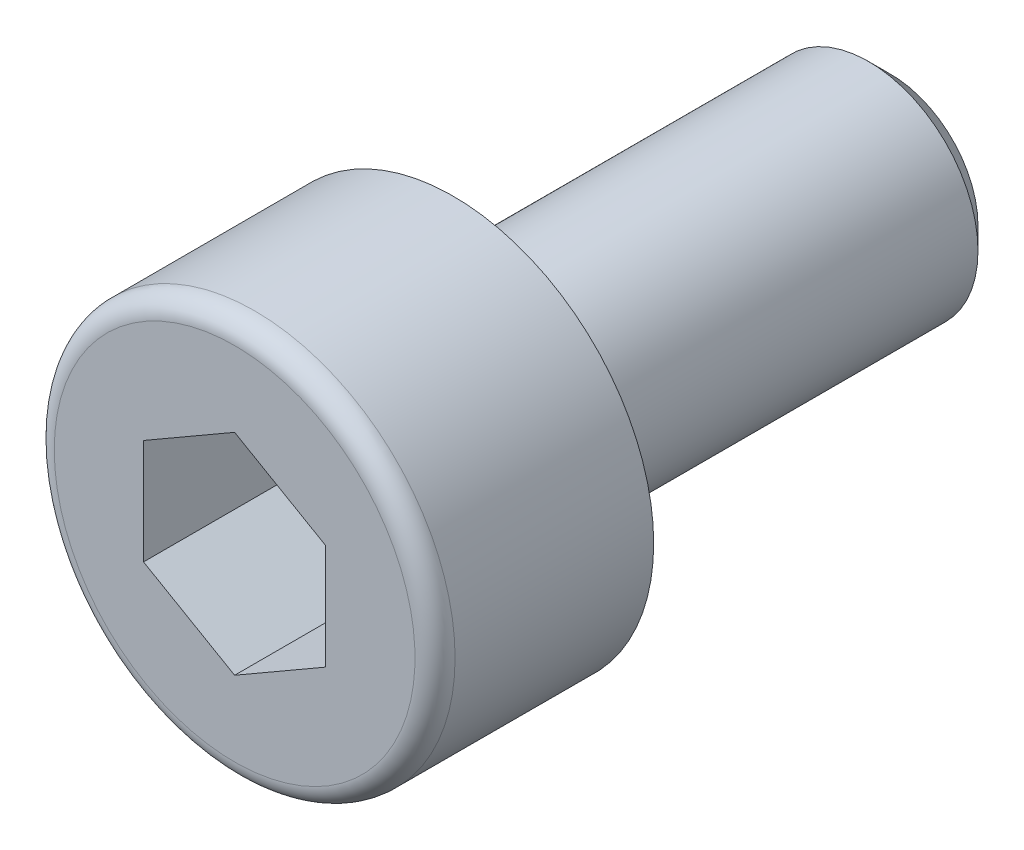
ISO-10303-21;
HEADER;
FILE_DESCRIPTION(('STEP AP214'),'2;1');
FILE_NAME('part.step','',(''),(''),'','','');
FILE_SCHEMA(('AUTOMOTIVE_DESIGN { 1 0 10303 214 1 1 1 1 }'));
ENDSEC;
DATA;
#1=APPLICATION_CONTEXT('core data for automotive mechanical design processes');
#2=APPLICATION_PROTOCOL_DEFINITION('international standard','automotive_design',2000,#1);
#3=PRODUCT_CONTEXT('',#1,'mechanical');
#4=PRODUCT('Part','Part','',(#3));
#5=PRODUCT_RELATED_PRODUCT_CATEGORY('part','',(#4));
#6=PRODUCT_DEFINITION_FORMATION('','',#4);
#7=PRODUCT_DEFINITION_CONTEXT('part definition',#1,'design');
#8=PRODUCT_DEFINITION('design','',#6,#7);
#9=PRODUCT_DEFINITION_SHAPE('','',#8);
#10=(LENGTH_UNIT() NAMED_UNIT(*) SI_UNIT(.MILLI.,.METRE.));
#11=(NAMED_UNIT(*) PLANE_ANGLE_UNIT() SI_UNIT($,.RADIAN.));
#12=(NAMED_UNIT(*) SI_UNIT($,.STERADIAN.) SOLID_ANGLE_UNIT());
#13=UNCERTAINTY_MEASURE_WITH_UNIT(LENGTH_MEASURE(1.E-05),#10,'distance_accuracy_value','');
#14=(GEOMETRIC_REPRESENTATION_CONTEXT(3) GLOBAL_UNCERTAINTY_ASSIGNED_CONTEXT((#13)) GLOBAL_UNIT_ASSIGNED_CONTEXT((#10,
#11,#12)) REPRESENTATION_CONTEXT('',''));
#15=CARTESIAN_POINT('',(0.,0.,0.));
#16=DIRECTION('',(0.,0.,1.));
#17=DIRECTION('',(1.,0.,0.));
#18=AXIS2_PLACEMENT_3D('',#15,#16,#17);
#19=CARTESIAN_POINT('',(0.,0.,3.));
#20=DIRECTION('',(0.,0.,-1.));
#21=DIRECTION('',(-1.,0.,0.));
#22=AXIS2_PLACEMENT_3D('',#19,#20,#21);
#23=PLANE('',#22);
#24=CARTESIAN_POINT('',(0.,0.,3.));
#25=DIRECTION('',(0.,0.,-1.));
#26=DIRECTION('',(-1.,0.,0.));
#27=AXIS2_PLACEMENT_3D('',#24,#25,#26);
#28=CIRCLE('',#27,2.475);
#29=CARTESIAN_POINT('',(-2.475,0.,3.));
#30=VERTEX_POINT('',#29);
#31=EDGE_CURVE('E177',#30,#30,#28,.F.);
#32=ORIENTED_EDGE('',*,*,#31,.T.);
#33=EDGE_LOOP('',(#32));
#34=FACE_BOUND('',#33,.T.);
#35=DIRECTION('',(-0.866025403784439,-0.5,0.));
#36=VECTOR('',#35,1.);
#37=CARTESIAN_POINT('',(0.,1.44337567297406,3.));
#38=LINE('',#37,#36);
#39=CARTESIAN_POINT('',(0.,1.44337567297406,3.));
#40=VERTEX_POINT('',#39);
#41=CARTESIAN_POINT('',(-1.25,0.721687836487032,3.));
#42=VERTEX_POINT('',#41);
#43=EDGE_CURVE('E141',#40,#42,#38,.T.);
#44=ORIENTED_EDGE('',*,*,#43,.F.);
#45=DIRECTION('',(-0.866025403784439,0.5,0.));
#46=VECTOR('',#45,1.);
#47=CARTESIAN_POINT('',(1.25,0.721687836487032,3.));
#48=LINE('',#47,#46);
#49=CARTESIAN_POINT('',(1.25,0.721687836487032,3.));
#50=VERTEX_POINT('',#49);
#51=EDGE_CURVE('E61',#50,#40,#48,.T.);
#52=ORIENTED_EDGE('',*,*,#51,.F.);
#53=DIRECTION('',(0.,1.,0.));
#54=VECTOR('',#53,1.);
#55=CARTESIAN_POINT('',(1.25,-0.721687836487032,3.));
#56=LINE('',#55,#54);
#57=CARTESIAN_POINT('',(1.25,-0.721687836487032,3.));
#58=VERTEX_POINT('',#57);
#59=EDGE_CURVE('E154',#58,#50,#56,.T.);
#60=ORIENTED_EDGE('',*,*,#59,.F.);
#61=DIRECTION('',(0.866025403784439,0.5,0.));
#62=VECTOR('',#61,1.);
#63=CARTESIAN_POINT('',(0.,-1.44337567297406,3.));
#64=LINE('',#63,#62);
#65=CARTESIAN_POINT('',(0.,-1.44337567297406,3.));
#66=VERTEX_POINT('',#65);
#67=EDGE_CURVE('E151',#66,#58,#64,.T.);
#68=ORIENTED_EDGE('',*,*,#67,.F.);
#69=DIRECTION('',(0.866025403784439,-0.5,0.));
#70=VECTOR('',#69,1.);
#71=CARTESIAN_POINT('',(-1.25,-0.721687836487033,3.));
#72=LINE('',#71,#70);
#73=CARTESIAN_POINT('',(-1.25,-0.721687836487033,3.));
#74=VERTEX_POINT('',#73);
#75=EDGE_CURVE('E109',#74,#66,#72,.T.);
#76=ORIENTED_EDGE('',*,*,#75,.F.);
#77=DIRECTION('',(0.,-1.,0.));
#78=VECTOR('',#77,1.);
#79=CARTESIAN_POINT('',(-1.25,0.721687836487032,3.));
#80=LINE('',#79,#78);
#81=EDGE_CURVE('E145',#42,#74,#80,.T.);
#82=ORIENTED_EDGE('',*,*,#81,.F.);
#83=EDGE_LOOP('',(#44,#52,#60,#68,#76,#82));
#84=FACE_BOUND('',#83,.T.);
#85=ADVANCED_FACE('F45',(#34,#84),#23,.F.);
#86=CARTESIAN_POINT('',(0.,0.,3.));
#87=DIRECTION('',(0.,0.,1.));
#88=DIRECTION('',(1.,0.,0.));
#89=AXIS2_PLACEMENT_3D('',#86,#87,#88);
#90=CYLINDRICAL_SURFACE('',#89,2.75);
#91=CARTESIAN_POINT('',(0.,0.,2.725));
#92=DIRECTION('',(0.,0.,-1.));
#93=DIRECTION('',(-1.,0.,0.));
#94=AXIS2_PLACEMENT_3D('',#91,#92,#93);
#95=CIRCLE('',#94,2.75);
#96=CARTESIAN_POINT('',(-2.75,0.,2.725));
#97=VERTEX_POINT('',#96);
#98=EDGE_CURVE('E181',#97,#97,#95,.T.);
#99=ORIENTED_EDGE('',*,*,#98,.T.);
#100=EDGE_LOOP('',(#99));
#101=FACE_BOUND('',#100,.T.);
#102=CARTESIAN_POINT('',(0.,0.,0.));
#103=DIRECTION('',(0.,0.,1.));
#104=DIRECTION('',(1.,0.,0.));
#105=AXIS2_PLACEMENT_3D('',#102,#103,#104);
#106=CIRCLE('',#105,2.75);
#107=CARTESIAN_POINT('',(2.75,0.,0.));
#108=VERTEX_POINT('',#107);
#109=EDGE_CURVE('E173',#108,#108,#106,.T.);
#110=ORIENTED_EDGE('',*,*,#109,.T.);
#111=EDGE_LOOP('',(#110));
#112=FACE_BOUND('',#111,.T.);
#113=ADVANCED_FACE('F201',(#101,#112),#90,.T.);
#114=CARTESIAN_POINT('',(0.,2.75,0.));
#115=DIRECTION('',(0.,0.,1.));
#116=DIRECTION('',(1.,0.,0.));
#117=AXIS2_PLACEMENT_3D('',#114,#115,#116);
#118=PLANE('',#117);
#119=ORIENTED_EDGE('',*,*,#109,.F.);
#120=EDGE_LOOP('',(#119));
#121=FACE_BOUND('',#120,.T.);
#122=CARTESIAN_POINT('',(0.,0.,0.));
#123=DIRECTION('',(0.,0.,1.));
#124=DIRECTION('',(1.,0.,0.));
#125=AXIS2_PLACEMENT_3D('',#122,#123,#124);
#126=CIRCLE('',#125,1.5);
#127=CARTESIAN_POINT('',(1.5,0.,0.));
#128=VERTEX_POINT('',#127);
#129=EDGE_CURVE('E160',#128,#128,#126,.T.);
#130=ORIENTED_EDGE('',*,*,#129,.T.);
#131=EDGE_LOOP('',(#130));
#132=FACE_BOUND('',#131,.T.);
#133=ADVANCED_FACE('F208',(#121,#132),#118,.F.);
#134=CARTESIAN_POINT('',(0.,0.,3.));
#135=DIRECTION('',(0.,0.,1.));
#136=DIRECTION('',(1.,0.,0.));
#137=AXIS2_PLACEMENT_3D('',#134,#135,#136);
#138=CYLINDRICAL_SURFACE('',#137,1.5);
#139=CARTESIAN_POINT('',(0.,0.,-5.7));
#140=DIRECTION('',(0.,0.,1.));
#141=DIRECTION('',(1.,0.,0.));
#142=AXIS2_PLACEMENT_3D('',#139,#140,#141);
#143=CIRCLE('',#142,1.5);
#144=CARTESIAN_POINT('',(1.5,0.,-5.7));
#145=VERTEX_POINT('',#144);
#146=EDGE_CURVE('E54',#145,#145,#143,.T.);
#147=ORIENTED_EDGE('',*,*,#146,.T.);
#148=EDGE_LOOP('',(#147));
#149=FACE_BOUND('',#148,.T.);
#150=ORIENTED_EDGE('',*,*,#129,.F.);
#151=EDGE_LOOP('',(#150));
#152=FACE_BOUND('',#151,.T.);
#153=ADVANCED_FACE('F188',(#149,#152),#138,.T.);
#154=CARTESIAN_POINT('',(0.,1.5,-6.));
#155=DIRECTION('',(0.,0.,1.));
#156=DIRECTION('',(1.,0.,0.));
#157=AXIS2_PLACEMENT_3D('',#154,#155,#156);
#158=PLANE('',#157);
#159=CARTESIAN_POINT('',(0.,0.,-6.));
#160=DIRECTION('',(0.,0.,1.));
#161=DIRECTION('',(1.,0.,0.));
#162=AXIS2_PLACEMENT_3D('',#159,#160,#161);
#163=CIRCLE('',#162,1.2);
#164=CARTESIAN_POINT('',(1.2,0.,-6.));
#165=VERTEX_POINT('',#164);
#166=EDGE_CURVE('E11',#165,#165,#163,.F.);
#167=ORIENTED_EDGE('',*,*,#166,.T.);
#168=EDGE_LOOP('',(#167));
#169=FACE_BOUND('',#168,.T.);
#170=ADVANCED_FACE('F218',(#169),#158,.F.);
#171=CARTESIAN_POINT('',(1.25,0.721687836487032,1.075));
#172=DIRECTION('',(0.5,0.866025403784439,0.));
#173=DIRECTION('',(-0.866025403784439,0.5,0.));
#174=AXIS2_PLACEMENT_3D('',#171,#172,#173);
#175=PLANE('',#174);
#176=ORIENTED_EDGE('',*,*,#51,.T.);
#177=DIRECTION('',(0.,0.,1.));
#178=VECTOR('',#177,1.);
#179=CARTESIAN_POINT('',(0.,1.44337567297406,1.075));
#180=LINE('',#179,#178);
#181=CARTESIAN_POINT('',(0.,1.44337567297406,1.075));
#182=VERTEX_POINT('',#181);
#183=EDGE_CURVE('E91',#182,#40,#180,.T.);
#184=ORIENTED_EDGE('',*,*,#183,.F.);
#185=DIRECTION('',(-0.866025403784439,0.5,0.));
#186=VECTOR('',#185,1.);
#187=CARTESIAN_POINT('',(1.25,0.721687836487032,1.075));
#188=LINE('',#187,#186);
#189=CARTESIAN_POINT('',(1.25,0.721687836487032,1.075));
#190=VERTEX_POINT('',#189);
#191=EDGE_CURVE('E157',#190,#182,#188,.T.);
#192=ORIENTED_EDGE('',*,*,#191,.F.);
#193=DIRECTION('',(0.,0.,1.));
#194=VECTOR('',#193,1.);
#195=CARTESIAN_POINT('',(1.25,0.721687836487032,1.075));
#196=LINE('',#195,#194);
#197=EDGE_CURVE('E69',#190,#50,#196,.T.);
#198=ORIENTED_EDGE('',*,*,#197,.T.);
#199=EDGE_LOOP('',(#176,#184,#192,#198));
#200=FACE_BOUND('',#199,.T.);
#201=ADVANCED_FACE('F220',(#200),#175,.F.);
#202=CARTESIAN_POINT('',(1.25,-0.721687836487032,1.075));
#203=DIRECTION('',(1.,0.,0.));
#204=DIRECTION('',(0.,0.,-1.));
#205=AXIS2_PLACEMENT_3D('',#202,#203,#204);
#206=PLANE('',#205);
#207=ORIENTED_EDGE('',*,*,#59,.T.);
#208=ORIENTED_EDGE('',*,*,#197,.F.);
#209=DIRECTION('',(0.,1.,0.));
#210=VECTOR('',#209,1.);
#211=CARTESIAN_POINT('',(1.25,-0.721687836487032,1.075));
#212=LINE('',#211,#210);
#213=CARTESIAN_POINT('',(1.25,-0.721687836487032,1.075));
#214=VERTEX_POINT('',#213);
#215=EDGE_CURVE('E123',#214,#190,#212,.T.);
#216=ORIENTED_EDGE('',*,*,#215,.F.);
#217=DIRECTION('',(0.,0.,1.));
#218=VECTOR('',#217,1.);
#219=CARTESIAN_POINT('',(1.25,-0.721687836487032,1.075));
#220=LINE('',#219,#218);
#221=EDGE_CURVE('E114',#214,#58,#220,.T.);
#222=ORIENTED_EDGE('',*,*,#221,.T.);
#223=EDGE_LOOP('',(#207,#208,#216,#222));
#224=FACE_BOUND('',#223,.T.);
#225=ADVANCED_FACE('F224',(#224),#206,.F.);
#226=CARTESIAN_POINT('',(0.,-1.44337567297406,1.075));
#227=DIRECTION('',(0.5,-0.866025403784439,0.));
#228=DIRECTION('',(0.866025403784439,0.5,0.));
#229=AXIS2_PLACEMENT_3D('',#226,#227,#228);
#230=PLANE('',#229);
#231=ORIENTED_EDGE('',*,*,#67,.T.);
#232=ORIENTED_EDGE('',*,*,#221,.F.);
#233=DIRECTION('',(0.866025403784439,0.5,0.));
#234=VECTOR('',#233,1.);
#235=CARTESIAN_POINT('',(0.,-1.44337567297406,1.075));
#236=LINE('',#235,#234);
#237=CARTESIAN_POINT('',(0.,-1.44337567297406,1.075));
#238=VERTEX_POINT('',#237);
#239=EDGE_CURVE('E118',#238,#214,#236,.T.);
#240=ORIENTED_EDGE('',*,*,#239,.F.);
#241=DIRECTION('',(0.,0.,1.));
#242=VECTOR('',#241,1.);
#243=CARTESIAN_POINT('',(0.,-1.44337567297406,1.075));
#244=LINE('',#243,#242);
#245=EDGE_CURVE('E102',#238,#66,#244,.T.);
#246=ORIENTED_EDGE('',*,*,#245,.T.);
#247=EDGE_LOOP('',(#231,#232,#240,#246));
#248=FACE_BOUND('',#247,.T.);
#249=ADVANCED_FACE('F119',(#248),#230,.F.);
#250=CARTESIAN_POINT('',(-1.25,-0.721687836487033,1.075));
#251=DIRECTION('',(-0.5,-0.866025403784439,0.));
#252=DIRECTION('',(0.866025403784439,-0.5,0.));
#253=AXIS2_PLACEMENT_3D('',#250,#251,#252);
#254=PLANE('',#253);
#255=ORIENTED_EDGE('',*,*,#75,.T.);
#256=ORIENTED_EDGE('',*,*,#245,.F.);
#257=DIRECTION('',(0.866025403784439,-0.5,0.));
#258=VECTOR('',#257,1.);
#259=CARTESIAN_POINT('',(-1.25,-0.721687836487033,1.075));
#260=LINE('',#259,#258);
#261=CARTESIAN_POINT('',(-1.25,-0.721687836487033,1.075));
#262=VERTEX_POINT('',#261);
#263=EDGE_CURVE('E106',#262,#238,#260,.T.);
#264=ORIENTED_EDGE('',*,*,#263,.F.);
#265=DIRECTION('',(0.,0.,1.));
#266=VECTOR('',#265,1.);
#267=CARTESIAN_POINT('',(-1.25,-0.721687836487033,1.075));
#268=LINE('',#267,#266);
#269=EDGE_CURVE('E115',#262,#74,#268,.T.);
#270=ORIENTED_EDGE('',*,*,#269,.T.);
#271=EDGE_LOOP('',(#255,#256,#264,#270));
#272=FACE_BOUND('',#271,.T.);
#273=ADVANCED_FACE('F104',(#272),#254,.F.);
#274=CARTESIAN_POINT('',(-1.25,0.721687836487032,1.075));
#275=DIRECTION('',(-1.,0.,0.));
#276=DIRECTION('',(0.,-1.,0.));
#277=AXIS2_PLACEMENT_3D('',#274,#275,#276);
#278=PLANE('',#277);
#279=ORIENTED_EDGE('',*,*,#81,.T.);
#280=ORIENTED_EDGE('',*,*,#269,.F.);
#281=DIRECTION('',(0.,-1.,0.));
#282=VECTOR('',#281,1.);
#283=CARTESIAN_POINT('',(-1.25,0.721687836487032,1.075));
#284=LINE('',#283,#282);
#285=CARTESIAN_POINT('',(-1.25,0.721687836487032,1.075));
#286=VERTEX_POINT('',#285);
#287=EDGE_CURVE('E129',#286,#262,#284,.T.);
#288=ORIENTED_EDGE('',*,*,#287,.F.);
#289=DIRECTION('',(0.,0.,1.));
#290=VECTOR('',#289,1.);
#291=CARTESIAN_POINT('',(-1.25,0.721687836487032,1.075));
#292=LINE('',#291,#290);
#293=EDGE_CURVE('E165',#286,#42,#292,.T.);
#294=ORIENTED_EDGE('',*,*,#293,.T.);
#295=EDGE_LOOP('',(#279,#280,#288,#294));
#296=FACE_BOUND('',#295,.T.);
#297=ADVANCED_FACE('F228',(#296),#278,.F.);
#298=CARTESIAN_POINT('',(0.,1.44337567297406,1.075));
#299=DIRECTION('',(-0.5,0.866025403784439,0.));
#300=DIRECTION('',(-0.866025403784439,-0.5,0.));
#301=AXIS2_PLACEMENT_3D('',#298,#299,#300);
#302=PLANE('',#301);
#303=ORIENTED_EDGE('',*,*,#43,.T.);
#304=ORIENTED_EDGE('',*,*,#293,.F.);
#305=DIRECTION('',(-0.866025403784439,-0.5,0.));
#306=VECTOR('',#305,1.);
#307=CARTESIAN_POINT('',(0.,1.44337567297406,1.075));
#308=LINE('',#307,#306);
#309=EDGE_CURVE('E133',#182,#286,#308,.T.);
#310=ORIENTED_EDGE('',*,*,#309,.F.);
#311=ORIENTED_EDGE('',*,*,#183,.T.);
#312=EDGE_LOOP('',(#303,#304,#310,#311));
#313=FACE_BOUND('',#312,.T.);
#314=ADVANCED_FACE('F225',(#313),#302,.F.);
#315=CARTESIAN_POINT('',(0.,1.44337567297406,1.075));
#316=DIRECTION('',(0.,0.,1.));
#317=DIRECTION('',(1.,0.,0.));
#318=AXIS2_PLACEMENT_3D('',#315,#316,#317);
#319=PLANE('',#318);
#320=ORIENTED_EDGE('',*,*,#191,.T.);
#321=ORIENTED_EDGE('',*,*,#309,.T.);
#322=ORIENTED_EDGE('',*,*,#287,.T.);
#323=ORIENTED_EDGE('',*,*,#263,.T.);
#324=ORIENTED_EDGE('',*,*,#239,.T.);
#325=ORIENTED_EDGE('',*,*,#215,.T.);
#326=EDGE_LOOP('',(#320,#321,#322,#323,#324,#325));
#327=FACE_BOUND('',#326,.T.);
#328=ADVANCED_FACE('F126',(#327),#319,.T.);
#329=CARTESIAN_POINT('',(0.,0.,2.725));
#330=DIRECTION('',(0.,0.,-1.));
#331=DIRECTION('',(-1.,0.,0.));
#332=AXIS2_PLACEMENT_3D('',#329,#330,#331);
#333=TOROIDAL_SURFACE('',#332,2.475,0.275);
#334=ORIENTED_EDGE('',*,*,#98,.F.);
#335=EDGE_LOOP('',(#334));
#336=FACE_BOUND('',#335,.T.);
#337=ORIENTED_EDGE('',*,*,#31,.F.);
#338=EDGE_LOOP('',(#337));
#339=FACE_BOUND('',#338,.T.);
#340=ADVANCED_FACE('F192',(#336,#339),#333,.T.);
#341=CARTESIAN_POINT('',(0.,0.,-5.7));
#342=DIRECTION('',(0.,0.,1.));
#343=DIRECTION('',(1.,0.,0.));
#344=AXIS2_PLACEMENT_3D('',#341,#342,#343);
#345=CONICAL_SURFACE('',#344,1.5,0.785398163397445);
#346=ORIENTED_EDGE('',*,*,#166,.F.);
#347=EDGE_LOOP('',(#346));
#348=FACE_BOUND('',#347,.T.);
#349=ORIENTED_EDGE('',*,*,#146,.F.);
#350=EDGE_LOOP('',(#349));
#351=FACE_BOUND('',#350,.T.);
#352=ADVANCED_FACE('F47',(#348,#351),#345,.T.);
#353=CLOSED_SHELL('',(#85,#113,#133,#153,#170,#201,#225,#249,#273,#297,#314,#328,#340,#352));
#354=MANIFOLD_SOLID_BREP('B2',#353);
#355=ADVANCED_BREP_SHAPE_REPRESENTATION('',(#18,#354),#14);
#356=SHAPE_DEFINITION_REPRESENTATION(#9,#355);
ENDSEC;
END-ISO-10303-21;
